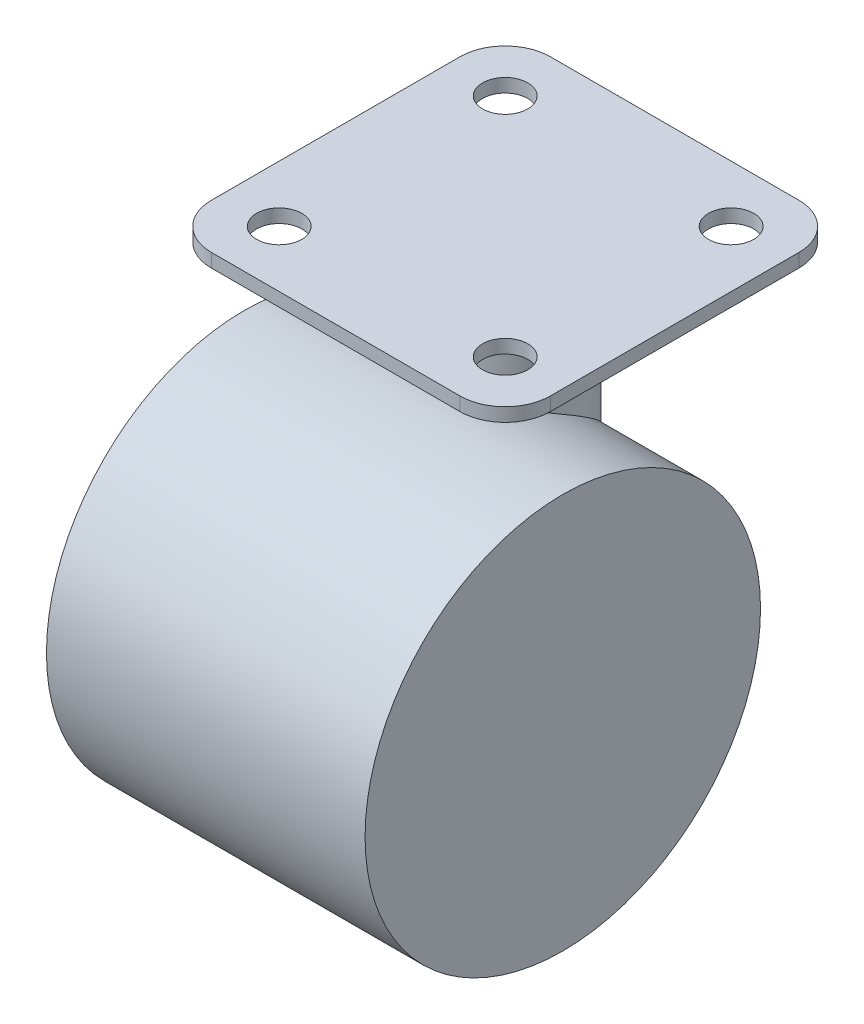
ISO-10303-21;
HEADER;
FILE_DESCRIPTION(('STEP AP214'),'2;1');
FILE_NAME('part.step','',(''),(''),'','','');
FILE_SCHEMA(('AUTOMOTIVE_DESIGN { 1 0 10303 214 1 1 1 1 }'));
ENDSEC;
DATA;
#1=APPLICATION_CONTEXT('core data for automotive mechanical design processes');
#2=APPLICATION_PROTOCOL_DEFINITION('international standard','automotive_design',2000,#1);
#3=PRODUCT_CONTEXT('',#1,'mechanical');
#4=PRODUCT('Part','Part','',(#3));
#5=PRODUCT_RELATED_PRODUCT_CATEGORY('part','',(#4));
#6=PRODUCT_DEFINITION_FORMATION('','',#4);
#7=PRODUCT_DEFINITION_CONTEXT('part definition',#1,'design');
#8=PRODUCT_DEFINITION('design','',#6,#7);
#9=PRODUCT_DEFINITION_SHAPE('','',#8);
#10=(LENGTH_UNIT() NAMED_UNIT(*) SI_UNIT(.MILLI.,.METRE.));
#11=(NAMED_UNIT(*) PLANE_ANGLE_UNIT() SI_UNIT($,.RADIAN.));
#12=(NAMED_UNIT(*) SI_UNIT($,.STERADIAN.) SOLID_ANGLE_UNIT());
#13=UNCERTAINTY_MEASURE_WITH_UNIT(LENGTH_MEASURE(1.E-05),#10,'distance_accuracy_value','');
#14=(GEOMETRIC_REPRESENTATION_CONTEXT(3) GLOBAL_UNCERTAINTY_ASSIGNED_CONTEXT((#13)) GLOBAL_UNIT_ASSIGNED_CONTEXT((#10,
#11,#12)) REPRESENTATION_CONTEXT('',''));
#15=CARTESIAN_POINT('',(0.,0.,0.));
#16=DIRECTION('',(0.,0.,1.));
#17=DIRECTION('',(1.,0.,0.));
#18=AXIS2_PLACEMENT_3D('',#15,#16,#17);
#19=CARTESIAN_POINT('',(14.1,-25.9,8.99999999999999));
#20=DIRECTION('',(-1.,0.,0.));
#21=DIRECTION('',(0.,0.,1.));
#22=AXIS2_PLACEMENT_3D('',#19,#20,#21);
#23=CYLINDRICAL_SURFACE('',#22,17.5);
#24=CARTESIAN_POINT('',(14.1,-25.9,8.99999999999999));
#25=DIRECTION('',(1.,0.,0.));
#26=DIRECTION('',(0.,0.,-1.));
#27=AXIS2_PLACEMENT_3D('',#24,#25,#26);
#28=CIRCLE('',#27,17.5);
#29=CARTESIAN_POINT('',(14.1,-25.9,-8.50000000000001));
#30=VERTEX_POINT('',#29);
#31=EDGE_CURVE('E11',#30,#30,#28,.T.);
#32=ORIENTED_EDGE('',*,*,#31,.F.);
#33=EDGE_LOOP('',(#32));
#34=FACE_BOUND('',#33,.T.);
#35=CARTESIAN_POINT('',(-14.1,-25.9,8.99999999999999));
#36=DIRECTION('',(1.,0.,0.));
#37=DIRECTION('',(0.,0.,-1.));
#38=AXIS2_PLACEMENT_3D('',#35,#36,#37);
#39=CIRCLE('',#38,17.5);
#40=CARTESIAN_POINT('',(-14.1,-25.9,-8.50000000000001));
#41=VERTEX_POINT('',#40);
#42=EDGE_CURVE('E45',#41,#41,#39,.T.);
#43=ORIENTED_EDGE('',*,*,#42,.T.);
#44=EDGE_LOOP('',(#43));
#45=FACE_BOUND('',#44,.T.);
#46=ADVANCED_FACE('F42',(#34,#45),#23,.T.);
#47=CARTESIAN_POINT('',(14.1,-25.9,8.99999999999999));
#48=DIRECTION('',(1.,0.,0.));
#49=DIRECTION('',(0.,0.,-1.));
#50=AXIS2_PLACEMENT_3D('',#47,#48,#49);
#51=PLANE('',#50);
#52=ORIENTED_EDGE('',*,*,#31,.T.);
#53=EDGE_LOOP('',(#52));
#54=FACE_BOUND('',#53,.T.);
#55=ADVANCED_FACE('F57',(#54),#51,.T.);
#56=CARTESIAN_POINT('',(-14.1,-25.9,8.99999999999999));
#57=DIRECTION('',(1.,0.,0.));
#58=DIRECTION('',(0.,0.,-1.));
#59=AXIS2_PLACEMENT_3D('',#56,#57,#58);
#60=PLANE('',#59);
#61=ORIENTED_EDGE('',*,*,#42,.F.);
#62=EDGE_LOOP('',(#61));
#63=FACE_BOUND('',#62,.T.);
#64=ADVANCED_FACE('F55',(#63),#60,.F.);
#65=CLOSED_SHELL('',(#46,#55,#64));
#66=MANIFOLD_SOLID_BREP('B2',#65);
#67=CARTESIAN_POINT('',(15.,-0.6,15.));
#68=DIRECTION('',(1.,0.,0.));
#69=DIRECTION('',(0.,0.,-1.));
#70=AXIS2_PLACEMENT_3D('',#67,#68,#69);
#71=PLANE('',#70);
#72=DIRECTION('',(0.,0.,-1.));
#73=VECTOR('',#72,1.);
#74=CARTESIAN_POINT('',(15.,-0.6,15.));
#75=LINE('',#74,#73);
#76=CARTESIAN_POINT('',(15.,-0.6,11.));
#77=VERTEX_POINT('',#76);
#78=CARTESIAN_POINT('',(15.,-0.6,-11.));
#79=VERTEX_POINT('',#78);
#80=EDGE_CURVE('E213',#77,#79,#75,.T.);
#81=ORIENTED_EDGE('',*,*,#80,.T.);
#82=DIRECTION('',(0.,1.,0.));
#83=VECTOR('',#82,1.);
#84=CARTESIAN_POINT('',(15.,-0.6,-11.));
#85=LINE('',#84,#83);
#86=CARTESIAN_POINT('',(15.,0.6,-11.));
#87=VERTEX_POINT('',#86);
#88=EDGE_CURVE('E167',#79,#87,#85,.T.);
#89=ORIENTED_EDGE('',*,*,#88,.T.);
#90=DIRECTION('',(0.,0.,-1.));
#91=VECTOR('',#90,1.);
#92=CARTESIAN_POINT('',(15.,0.6,15.));
#93=LINE('',#92,#91);
#94=CARTESIAN_POINT('',(15.,0.6,11.));
#95=VERTEX_POINT('',#94);
#96=EDGE_CURVE('E151',#95,#87,#93,.T.);
#97=ORIENTED_EDGE('',*,*,#96,.F.);
#98=DIRECTION('',(0.,1.,0.));
#99=VECTOR('',#98,1.);
#100=CARTESIAN_POINT('',(15.,-0.6,11.));
#101=LINE('',#100,#99);
#102=EDGE_CURVE('E164',#95,#77,#101,.F.);
#103=ORIENTED_EDGE('',*,*,#102,.T.);
#104=EDGE_LOOP('',(#81,#89,#97,#103));
#105=FACE_BOUND('',#104,.T.);
#106=ADVANCED_FACE('F82',(#105),#71,.T.);
#107=CARTESIAN_POINT('',(-15.,-0.6,15.));
#108=DIRECTION('',(0.,0.,1.));
#109=DIRECTION('',(1.,0.,0.));
#110=AXIS2_PLACEMENT_3D('',#107,#108,#109);
#111=PLANE('',#110);
#112=DIRECTION('',(1.,0.,0.));
#113=VECTOR('',#112,1.);
#114=CARTESIAN_POINT('',(-15.,-0.6,15.));
#115=LINE('',#114,#113);
#116=CARTESIAN_POINT('',(-11.,-0.6,15.));
#117=VERTEX_POINT('',#116);
#118=CARTESIAN_POINT('',(11.,-0.6,15.));
#119=VERTEX_POINT('',#118);
#120=EDGE_CURVE('E174',#117,#119,#115,.T.);
#121=ORIENTED_EDGE('',*,*,#120,.T.);
#122=DIRECTION('',(0.,1.,0.));
#123=VECTOR('',#122,1.);
#124=CARTESIAN_POINT('',(11.,-0.6,15.));
#125=LINE('',#124,#123);
#126=CARTESIAN_POINT('',(11.,0.6,15.));
#127=VERTEX_POINT('',#126);
#128=EDGE_CURVE('E200',#119,#127,#125,.T.);
#129=ORIENTED_EDGE('',*,*,#128,.T.);
#130=DIRECTION('',(1.,0.,0.));
#131=VECTOR('',#130,1.);
#132=CARTESIAN_POINT('',(-15.,0.6,15.));
#133=LINE('',#132,#131);
#134=CARTESIAN_POINT('',(-11.,0.6,15.));
#135=VERTEX_POINT('',#134);
#136=EDGE_CURVE('E153',#135,#127,#133,.T.);
#137=ORIENTED_EDGE('',*,*,#136,.F.);
#138=DIRECTION('',(0.,1.,0.));
#139=VECTOR('',#138,1.);
#140=CARTESIAN_POINT('',(-11.,-0.6,15.));
#141=LINE('',#140,#139);
#142=EDGE_CURVE('E198',#135,#117,#141,.F.);
#143=ORIENTED_EDGE('',*,*,#142,.T.);
#144=EDGE_LOOP('',(#121,#129,#137,#143));
#145=FACE_BOUND('',#144,.T.);
#146=ADVANCED_FACE('F202',(#145),#111,.T.);
#147=CARTESIAN_POINT('',(-15.,-0.6,15.));
#148=DIRECTION('',(-1.,0.,0.));
#149=DIRECTION('',(0.,0.,1.));
#150=AXIS2_PLACEMENT_3D('',#147,#148,#149);
#151=PLANE('',#150);
#152=DIRECTION('',(0.,0.,1.));
#153=VECTOR('',#152,1.);
#154=CARTESIAN_POINT('',(-15.,-0.6,15.));
#155=LINE('',#154,#153);
#156=CARTESIAN_POINT('',(-15.,-0.6,-11.));
#157=VERTEX_POINT('',#156);
#158=CARTESIAN_POINT('',(-15.,-0.6,11.));
#159=VERTEX_POINT('',#158);
#160=EDGE_CURVE('E179',#157,#159,#155,.T.);
#161=ORIENTED_EDGE('',*,*,#160,.T.);
#162=DIRECTION('',(0.,1.,0.));
#163=VECTOR('',#162,1.);
#164=CARTESIAN_POINT('',(-15.,-0.6,11.));
#165=LINE('',#164,#163);
#166=CARTESIAN_POINT('',(-15.,0.6,11.));
#167=VERTEX_POINT('',#166);
#168=EDGE_CURVE('E40',#159,#167,#165,.T.);
#169=ORIENTED_EDGE('',*,*,#168,.T.);
#170=DIRECTION('',(0.,0.,1.));
#171=VECTOR('',#170,1.);
#172=CARTESIAN_POINT('',(-15.,0.6,15.));
#173=LINE('',#172,#171);
#174=CARTESIAN_POINT('',(-15.,0.6,-11.));
#175=VERTEX_POINT('',#174);
#176=EDGE_CURVE('E211',#175,#167,#173,.T.);
#177=ORIENTED_EDGE('',*,*,#176,.F.);
#178=DIRECTION('',(0.,1.,0.));
#179=VECTOR('',#178,1.);
#180=CARTESIAN_POINT('',(-15.,-0.6,-11.));
#181=LINE('',#180,#179);
#182=EDGE_CURVE('E90',#175,#157,#181,.F.);
#183=ORIENTED_EDGE('',*,*,#182,.T.);
#184=EDGE_LOOP('',(#161,#169,#177,#183));
#185=FACE_BOUND('',#184,.T.);
#186=ADVANCED_FACE('F210',(#185),#151,.T.);
#187=CARTESIAN_POINT('',(-15.,-0.6,-15.));
#188=DIRECTION('',(0.,0.,-1.));
#189=DIRECTION('',(-1.,0.,0.));
#190=AXIS2_PLACEMENT_3D('',#187,#188,#189);
#191=PLANE('',#190);
#192=DIRECTION('',(-1.,0.,0.));
#193=VECTOR('',#192,1.);
#194=CARTESIAN_POINT('',(-15.,0.6,-15.));
#195=LINE('',#194,#193);
#196=CARTESIAN_POINT('',(11.,0.6,-15.));
#197=VERTEX_POINT('',#196);
#198=CARTESIAN_POINT('',(-11.,0.6,-15.));
#199=VERTEX_POINT('',#198);
#200=EDGE_CURVE('E168',#197,#199,#195,.T.);
#201=ORIENTED_EDGE('',*,*,#200,.F.);
#202=DIRECTION('',(0.,1.,0.));
#203=VECTOR('',#202,1.);
#204=CARTESIAN_POINT('',(11.,-0.6,-15.));
#205=LINE('',#204,#203);
#206=CARTESIAN_POINT('',(11.,-0.6,-15.));
#207=VERTEX_POINT('',#206);
#208=EDGE_CURVE('E190',#197,#207,#205,.F.);
#209=ORIENTED_EDGE('',*,*,#208,.T.);
#210=DIRECTION('',(-1.,0.,0.));
#211=VECTOR('',#210,1.);
#212=CARTESIAN_POINT('',(-15.,-0.6,-15.));
#213=LINE('',#212,#211);
#214=CARTESIAN_POINT('',(-11.,-0.6,-15.));
#215=VERTEX_POINT('',#214);
#216=EDGE_CURVE('E217',#207,#215,#213,.T.);
#217=ORIENTED_EDGE('',*,*,#216,.T.);
#218=DIRECTION('',(0.,1.,0.));
#219=VECTOR('',#218,1.);
#220=CARTESIAN_POINT('',(-11.,-0.6,-15.));
#221=LINE('',#220,#219);
#222=EDGE_CURVE('E187',#215,#199,#221,.T.);
#223=ORIENTED_EDGE('',*,*,#222,.T.);
#224=EDGE_LOOP('',(#201,#209,#217,#223));
#225=FACE_BOUND('',#224,.T.);
#226=ADVANCED_FACE('F271',(#225),#191,.T.);
#227=CARTESIAN_POINT('',(0.,-0.6,0.));
#228=DIRECTION('',(0.,-1.,0.));
#229=DIRECTION('',(0.,0.,-1.));
#230=AXIS2_PLACEMENT_3D('',#227,#228,#229);
#231=PLANE('',#230);
#232=CARTESIAN_POINT('',(0.,-0.6,0.));
#233=DIRECTION('',(0.,-1.,0.));
#234=DIRECTION('',(0.,0.,-1.));
#235=AXIS2_PLACEMENT_3D('',#232,#233,#234);
#236=CIRCLE('',#235,6.);
#237=CARTESIAN_POINT('',(0.,-0.6,-6.));
#238=VERTEX_POINT('',#237);
#239=EDGE_CURVE('E251',#238,#238,#236,.T.);
#240=ORIENTED_EDGE('',*,*,#239,.F.);
#241=EDGE_LOOP('',(#240));
#242=FACE_BOUND('',#241,.T.);
#243=CARTESIAN_POINT('',(10.,-0.6,-10.));
#244=DIRECTION('',(0.,1.,0.));
#245=DIRECTION('',(0.,0.,1.));
#246=AXIS2_PLACEMENT_3D('',#243,#244,#245);
#247=CIRCLE('',#246,2.00000000000001);
#248=CARTESIAN_POINT('',(10.,-0.6,-7.99999999999999));
#249=VERTEX_POINT('',#248);
#250=EDGE_CURVE('E224',#249,#249,#247,.T.);
#251=ORIENTED_EDGE('',*,*,#250,.T.);
#252=EDGE_LOOP('',(#251));
#253=FACE_BOUND('',#252,.T.);
#254=CARTESIAN_POINT('',(10.,-0.6,10.));
#255=DIRECTION('',(0.,1.,0.));
#256=DIRECTION('',(0.,0.,1.));
#257=AXIS2_PLACEMENT_3D('',#254,#255,#256);
#258=CIRCLE('',#257,2.00000000000001);
#259=CARTESIAN_POINT('',(10.,-0.6,12.));
#260=VERTEX_POINT('',#259);
#261=EDGE_CURVE('E237',#260,#260,#258,.T.);
#262=ORIENTED_EDGE('',*,*,#261,.T.);
#263=EDGE_LOOP('',(#262));
#264=FACE_BOUND('',#263,.T.);
#265=CARTESIAN_POINT('',(-10.,-0.6,10.));
#266=DIRECTION('',(0.,1.,0.));
#267=DIRECTION('',(0.,0.,1.));
#268=AXIS2_PLACEMENT_3D('',#265,#266,#267);
#269=CIRCLE('',#268,2.);
#270=CARTESIAN_POINT('',(-10.,-0.6,12.));
#271=VERTEX_POINT('',#270);
#272=EDGE_CURVE('E230',#271,#271,#269,.T.);
#273=ORIENTED_EDGE('',*,*,#272,.T.);
#274=EDGE_LOOP('',(#273));
#275=FACE_BOUND('',#274,.T.);
#276=CARTESIAN_POINT('',(-10.,-0.6,-10.));
#277=DIRECTION('',(0.,1.,0.));
#278=DIRECTION('',(0.,0.,1.));
#279=AXIS2_PLACEMENT_3D('',#276,#277,#278);
#280=CIRCLE('',#279,2.);
#281=CARTESIAN_POINT('',(-10.,-0.6,-8.));
#282=VERTEX_POINT('',#281);
#283=EDGE_CURVE('E169',#282,#282,#280,.T.);
#284=ORIENTED_EDGE('',*,*,#283,.T.);
#285=EDGE_LOOP('',(#284));
#286=FACE_BOUND('',#285,.T.);
#287=ORIENTED_EDGE('',*,*,#216,.F.);
#288=CARTESIAN_POINT('',(11.,-0.6,-11.));
#289=DIRECTION('',(0.,-1.,0.));
#290=DIRECTION('',(0.,0.,-1.));
#291=AXIS2_PLACEMENT_3D('',#288,#289,#290);
#292=CIRCLE('',#291,4.);
#293=EDGE_CURVE('E196',#207,#79,#292,.T.);
#294=ORIENTED_EDGE('',*,*,#293,.T.);
#295=ORIENTED_EDGE('',*,*,#80,.F.);
#296=CARTESIAN_POINT('',(11.,-0.6,11.));
#297=DIRECTION('',(0.,-1.,0.));
#298=DIRECTION('',(0.,0.,-1.));
#299=AXIS2_PLACEMENT_3D('',#296,#297,#298);
#300=CIRCLE('',#299,4.);
#301=EDGE_CURVE('E173',#77,#119,#300,.T.);
#302=ORIENTED_EDGE('',*,*,#301,.T.);
#303=ORIENTED_EDGE('',*,*,#120,.F.);
#304=CARTESIAN_POINT('',(-11.,-0.6,11.));
#305=DIRECTION('',(0.,-1.,0.));
#306=DIRECTION('',(0.,0.,-1.));
#307=AXIS2_PLACEMENT_3D('',#304,#305,#306);
#308=CIRCLE('',#307,4.);
#309=EDGE_CURVE('E97',#117,#159,#308,.T.);
#310=ORIENTED_EDGE('',*,*,#309,.T.);
#311=ORIENTED_EDGE('',*,*,#160,.F.);
#312=CARTESIAN_POINT('',(-11.,-0.6,-11.));
#313=DIRECTION('',(0.,-1.,0.));
#314=DIRECTION('',(0.,0.,-1.));
#315=AXIS2_PLACEMENT_3D('',#312,#313,#314);
#316=CIRCLE('',#315,4.);
#317=EDGE_CURVE('E192',#157,#215,#316,.T.);
#318=ORIENTED_EDGE('',*,*,#317,.T.);
#319=EDGE_LOOP('',(#287,#294,#295,#302,#303,#310,#311,#318));
#320=FACE_BOUND('',#319,.T.);
#321=ADVANCED_FACE('F205',(#242,#253,#264,#275,#286,#320),#231,.T.);
#322=CARTESIAN_POINT('',(0.,0.6,0.));
#323=DIRECTION('',(0.,-1.,0.));
#324=DIRECTION('',(0.,0.,-1.));
#325=AXIS2_PLACEMENT_3D('',#322,#323,#324);
#326=PLANE('',#325);
#327=CARTESIAN_POINT('',(10.,0.6,-10.));
#328=DIRECTION('',(0.,1.,0.));
#329=DIRECTION('',(0.,0.,1.));
#330=AXIS2_PLACEMENT_3D('',#327,#328,#329);
#331=CIRCLE('',#330,2.00000000000001);
#332=CARTESIAN_POINT('',(10.,0.6,-7.99999999999999));
#333=VERTEX_POINT('',#332);
#334=EDGE_CURVE('E240',#333,#333,#331,.T.);
#335=ORIENTED_EDGE('',*,*,#334,.F.);
#336=EDGE_LOOP('',(#335));
#337=FACE_BOUND('',#336,.T.);
#338=CARTESIAN_POINT('',(10.,0.6,10.));
#339=DIRECTION('',(0.,1.,0.));
#340=DIRECTION('',(0.,0.,1.));
#341=AXIS2_PLACEMENT_3D('',#338,#339,#340);
#342=CIRCLE('',#341,2.00000000000001);
#343=CARTESIAN_POINT('',(10.,0.6,12.));
#344=VERTEX_POINT('',#343);
#345=EDGE_CURVE('E234',#344,#344,#342,.T.);
#346=ORIENTED_EDGE('',*,*,#345,.F.);
#347=EDGE_LOOP('',(#346));
#348=FACE_BOUND('',#347,.T.);
#349=CARTESIAN_POINT('',(-10.,0.6,10.));
#350=DIRECTION('',(0.,1.,0.));
#351=DIRECTION('',(0.,0.,1.));
#352=AXIS2_PLACEMENT_3D('',#349,#350,#351);
#353=CIRCLE('',#352,2.);
#354=CARTESIAN_POINT('',(-10.,0.6,12.));
#355=VERTEX_POINT('',#354);
#356=EDGE_CURVE('E227',#355,#355,#353,.T.);
#357=ORIENTED_EDGE('',*,*,#356,.F.);
#358=EDGE_LOOP('',(#357));
#359=FACE_BOUND('',#358,.T.);
#360=CARTESIAN_POINT('',(-10.,0.6,-10.));
#361=DIRECTION('',(0.,1.,0.));
#362=DIRECTION('',(0.,0.,1.));
#363=AXIS2_PLACEMENT_3D('',#360,#361,#362);
#364=CIRCLE('',#363,2.);
#365=CARTESIAN_POINT('',(-10.,0.6,-8.));
#366=VERTEX_POINT('',#365);
#367=EDGE_CURVE('E221',#366,#366,#364,.T.);
#368=ORIENTED_EDGE('',*,*,#367,.F.);
#369=EDGE_LOOP('',(#368));
#370=FACE_BOUND('',#369,.T.);
#371=ORIENTED_EDGE('',*,*,#96,.T.);
#372=CARTESIAN_POINT('',(11.,0.6,-11.));
#373=DIRECTION('',(0.,-1.,0.));
#374=DIRECTION('',(0.,0.,-1.));
#375=AXIS2_PLACEMENT_3D('',#372,#373,#374);
#376=CIRCLE('',#375,4.);
#377=EDGE_CURVE('E158',#87,#197,#376,.F.);
#378=ORIENTED_EDGE('',*,*,#377,.T.);
#379=ORIENTED_EDGE('',*,*,#200,.T.);
#380=CARTESIAN_POINT('',(-11.,0.6,-11.));
#381=DIRECTION('',(0.,-1.,0.));
#382=DIRECTION('',(0.,0.,-1.));
#383=AXIS2_PLACEMENT_3D('',#380,#381,#382);
#384=CIRCLE('',#383,4.);
#385=EDGE_CURVE('E176',#199,#175,#384,.F.);
#386=ORIENTED_EDGE('',*,*,#385,.T.);
#387=ORIENTED_EDGE('',*,*,#176,.T.);
#388=CARTESIAN_POINT('',(-11.,0.6,11.));
#389=DIRECTION('',(0.,-1.,0.));
#390=DIRECTION('',(0.,0.,-1.));
#391=AXIS2_PLACEMENT_3D('',#388,#389,#390);
#392=CIRCLE('',#391,4.);
#393=EDGE_CURVE('E159',#167,#135,#392,.F.);
#394=ORIENTED_EDGE('',*,*,#393,.T.);
#395=ORIENTED_EDGE('',*,*,#136,.T.);
#396=CARTESIAN_POINT('',(11.,0.6,11.));
#397=DIRECTION('',(0.,-1.,0.));
#398=DIRECTION('',(0.,0.,-1.));
#399=AXIS2_PLACEMENT_3D('',#396,#397,#398);
#400=CIRCLE('',#399,4.);
#401=EDGE_CURVE('E148',#127,#95,#400,.F.);
#402=ORIENTED_EDGE('',*,*,#401,.T.);
#403=EDGE_LOOP('',(#371,#378,#379,#386,#387,#394,#395,#402));
#404=FACE_BOUND('',#403,.T.);
#405=ADVANCED_FACE('F150',(#337,#348,#359,#370,#404),#326,.F.);
#406=CARTESIAN_POINT('',(-10.,-0.6,-10.));
#407=DIRECTION('',(0.,1.,0.));
#408=DIRECTION('',(0.,0.,1.));
#409=AXIS2_PLACEMENT_3D('',#406,#407,#408);
#410=CYLINDRICAL_SURFACE('',#409,2.);
#411=ORIENTED_EDGE('',*,*,#283,.F.);
#412=EDGE_LOOP('',(#411));
#413=FACE_BOUND('',#412,.T.);
#414=ORIENTED_EDGE('',*,*,#367,.T.);
#415=EDGE_LOOP('',(#414));
#416=FACE_BOUND('',#415,.T.);
#417=ADVANCED_FACE('F303',(#413,#416),#410,.F.);
#418=CARTESIAN_POINT('',(-10.,-0.6,10.));
#419=DIRECTION('',(0.,1.,0.));
#420=DIRECTION('',(0.,0.,1.));
#421=AXIS2_PLACEMENT_3D('',#418,#419,#420);
#422=CYLINDRICAL_SURFACE('',#421,2.);
#423=ORIENTED_EDGE('',*,*,#272,.F.);
#424=EDGE_LOOP('',(#423));
#425=FACE_BOUND('',#424,.T.);
#426=ORIENTED_EDGE('',*,*,#356,.T.);
#427=EDGE_LOOP('',(#426));
#428=FACE_BOUND('',#427,.T.);
#429=ADVANCED_FACE('F308',(#425,#428),#422,.F.);
#430=CARTESIAN_POINT('',(10.,-0.6,10.));
#431=DIRECTION('',(0.,1.,0.));
#432=DIRECTION('',(0.,0.,1.));
#433=AXIS2_PLACEMENT_3D('',#430,#431,#432);
#434=CYLINDRICAL_SURFACE('',#433,2.00000000000001);
#435=ORIENTED_EDGE('',*,*,#261,.F.);
#436=EDGE_LOOP('',(#435));
#437=FACE_BOUND('',#436,.T.);
#438=ORIENTED_EDGE('',*,*,#345,.T.);
#439=EDGE_LOOP('',(#438));
#440=FACE_BOUND('',#439,.T.);
#441=ADVANCED_FACE('F312',(#437,#440),#434,.F.);
#442=CARTESIAN_POINT('',(10.,-0.6,-10.));
#443=DIRECTION('',(0.,1.,0.));
#444=DIRECTION('',(0.,0.,1.));
#445=AXIS2_PLACEMENT_3D('',#442,#443,#444);
#446=CYLINDRICAL_SURFACE('',#445,2.00000000000001);
#447=ORIENTED_EDGE('',*,*,#250,.F.);
#448=EDGE_LOOP('',(#447));
#449=FACE_BOUND('',#448,.T.);
#450=ORIENTED_EDGE('',*,*,#334,.T.);
#451=EDGE_LOOP('',(#450));
#452=FACE_BOUND('',#451,.T.);
#453=ADVANCED_FACE('F276',(#449,#452),#446,.F.);
#454=CARTESIAN_POINT('',(11.,-0.6,-11.));
#455=DIRECTION('',(0.,1.,0.));
#456=DIRECTION('',(0.,0.,1.));
#457=AXIS2_PLACEMENT_3D('',#454,#455,#456);
#458=CYLINDRICAL_SURFACE('',#457,4.);
#459=ORIENTED_EDGE('',*,*,#293,.F.);
#460=ORIENTED_EDGE('',*,*,#208,.F.);
#461=ORIENTED_EDGE('',*,*,#377,.F.);
#462=ORIENTED_EDGE('',*,*,#88,.F.);
#463=EDGE_LOOP('',(#459,#460,#461,#462));
#464=FACE_BOUND('',#463,.T.);
#465=ADVANCED_FACE('F273',(#464),#458,.T.);
#466=CARTESIAN_POINT('',(11.,-0.6,11.));
#467=DIRECTION('',(0.,1.,0.));
#468=DIRECTION('',(0.,0.,1.));
#469=AXIS2_PLACEMENT_3D('',#466,#467,#468);
#470=CYLINDRICAL_SURFACE('',#469,4.);
#471=ORIENTED_EDGE('',*,*,#301,.F.);
#472=ORIENTED_EDGE('',*,*,#102,.F.);
#473=ORIENTED_EDGE('',*,*,#401,.F.);
#474=ORIENTED_EDGE('',*,*,#128,.F.);
#475=EDGE_LOOP('',(#471,#472,#473,#474));
#476=FACE_BOUND('',#475,.T.);
#477=ADVANCED_FACE('F172',(#476),#470,.T.);
#478=CARTESIAN_POINT('',(-11.,-0.6,11.));
#479=DIRECTION('',(0.,1.,0.));
#480=DIRECTION('',(0.,0.,1.));
#481=AXIS2_PLACEMENT_3D('',#478,#479,#480);
#482=CYLINDRICAL_SURFACE('',#481,4.);
#483=ORIENTED_EDGE('',*,*,#309,.F.);
#484=ORIENTED_EDGE('',*,*,#142,.F.);
#485=ORIENTED_EDGE('',*,*,#393,.F.);
#486=ORIENTED_EDGE('',*,*,#168,.F.);
#487=EDGE_LOOP('',(#483,#484,#485,#486));
#488=FACE_BOUND('',#487,.T.);
#489=ADVANCED_FACE('F208',(#488),#482,.T.);
#490=CARTESIAN_POINT('',(-11.,-0.6,-11.));
#491=DIRECTION('',(0.,1.,0.));
#492=DIRECTION('',(0.,0.,1.));
#493=AXIS2_PLACEMENT_3D('',#490,#491,#492);
#494=CYLINDRICAL_SURFACE('',#493,4.);
#495=ORIENTED_EDGE('',*,*,#317,.F.);
#496=ORIENTED_EDGE('',*,*,#182,.F.);
#497=ORIENTED_EDGE('',*,*,#385,.F.);
#498=ORIENTED_EDGE('',*,*,#222,.F.);
#499=EDGE_LOOP('',(#495,#496,#497,#498));
#500=FACE_BOUND('',#499,.T.);
#501=ADVANCED_FACE('F84',(#500),#494,.T.);
#502=CARTESIAN_POINT('',(0.,-43.401,0.));
#503=DIRECTION('',(0.,1.,0.));
#504=DIRECTION('',(0.,0.,1.));
#505=AXIS2_PLACEMENT_3D('',#502,#503,#504);
#506=CYLINDRICAL_SURFACE('',#505,6.);
#507=ORIENTED_EDGE('',*,*,#239,.T.);
#508=EDGE_LOOP('',(#507));
#509=FACE_BOUND('',#508,.T.);
#510=CARTESIAN_POINT('',(0.,-8.65906035043332,6.));
#511=CARTESIAN_POINT('',(-0.165550131336847,-8.65906152566624,6.00000272383897));
#512=CARTESIAN_POINT('',(-0.331063350792486,-8.66024913906501,5.9931463990695));
#513=CARTESIAN_POINT('',(-0.660971772576927,-8.66504415702075,5.96577772936452));
#514=CARTESIAN_POINT('',(-0.825366766900127,-8.66865199997723,5.94526291033941));
#515=CARTESIAN_POINT('',(-1.15191396682122,-8.67841161820516,5.89071448550199));
#516=CARTESIAN_POINT('',(-1.3140648341121,-8.68456484914352,5.85667314452679));
#517=CARTESIAN_POINT('',(-1.63493916669699,-8.69961684881858,5.77532476663341));
#518=CARTESIAN_POINT('',(-1.79366136232179,-8.70851661658778,5.72801290323214));
#519=CARTESIAN_POINT('',(-2.10641558102023,-8.72932246264401,5.62052884627702));
#520=CARTESIAN_POINT('',(-2.26044947516237,-8.74122732351219,5.56036186208299));
#521=CARTESIAN_POINT('',(-2.56285479346125,-8.76837175154052,5.42761956933155));
#522=CARTESIAN_POINT('',(-2.71122362516827,-8.78361282444005,5.35503866121712));
#523=CARTESIAN_POINT('',(-3.00111636081653,-8.81778246512559,5.19812067078887));
#524=CARTESIAN_POINT('',(-3.14264198476074,-8.83671010023714,5.11378656348427));
#525=CARTESIAN_POINT('',(-3.41780550483394,-8.87862632428406,4.93412509729673));
#526=CARTESIAN_POINT('',(-3.55144703925272,-8.90161302020603,4.83880287007793));
#527=CARTESIAN_POINT('',(-3.80921694340567,-8.95188709696103,4.63857158868817));
#528=CARTESIAN_POINT('',(-3.93339585840265,-8.97914883817727,4.53372116303023));
#529=CARTESIAN_POINT('',(-4.17220277682237,-9.03840779487226,4.31496635368302));
#530=CARTESIAN_POINT('',(-4.28683422053429,-9.07040329297306,4.20106526042903));
#531=CARTESIAN_POINT('',(-4.50586953355639,-9.13944591969436,3.96522892316075));
#532=CARTESIAN_POINT('',(-4.61027269437795,-9.17649339782885,3.84329312357873));
#533=CARTESIAN_POINT('',(-4.80823850085369,-9.25588120633936,3.5925421936756));
#534=CARTESIAN_POINT('',(-4.90180115689918,-9.29822153164176,3.46372706994894));
#535=CARTESIAN_POINT('',(-5.07737695483321,-9.3882284411996,3.2008062533313));
#536=CARTESIAN_POINT('',(-5.15942259886251,-9.43587932675666,3.06671687426342));
#537=CARTESIAN_POINT('',(-5.31201654118163,-9.53669625791185,2.79408190579823));
#538=CARTESIAN_POINT('',(-5.38256090016694,-9.58986418298993,2.65553480896125));
#539=CARTESIAN_POINT('',(-5.5119677424943,-9.70166588601694,2.37529471538089));
#540=CARTESIAN_POINT('',(-5.57083386909727,-9.76029795090074,2.23360271514008));
#541=CARTESIAN_POINT('',(-5.67695872818618,-9.88295482548536,1.94816266514437));
#542=CARTESIAN_POINT('',(-5.72421305799608,-9.94698166832777,1.80441385733268));
#543=CARTESIAN_POINT('',(-5.80905573146923,-10.0831178645457,1.50976066723073));
#544=CARTESIAN_POINT('',(-5.84613625919004,-10.1554572729734,1.35881622448368));
#545=CARTESIAN_POINT('',(-5.90815932316817,-10.3055002110392,1.05707602973262));
#546=CARTESIAN_POINT('',(-5.93309741599456,-10.383205692491,0.906280352283244));
#547=CARTESIAN_POINT('',(-5.99031821615814,-10.6238664495086,0.455685749934423));
#548=CARTESIAN_POINT('',(-6.00504135474413,-10.7944219525566,0.157557638630977));
#549=CARTESIAN_POINT('',(-5.9911088463481,-11.1746441070162,-0.46376625766591));
#550=CARTESIAN_POINT('',(-5.95679656865313,-11.3865344035128,-0.785432798033382));
#551=CARTESIAN_POINT('',(-5.84097128435526,-11.8265591236889,-1.40834788610983));
#552=CARTESIAN_POINT('',(-5.7594550353644,-12.0546946622918,-1.70959502964532));
#553=CARTESIAN_POINT('',(-5.59623613918111,-12.4279762370465,-2.17157640481848));
#554=CARTESIAN_POINT('',(-5.52780507936888,-12.5695808159463,-2.34007800686525));
#555=CARTESIAN_POINT('',(-5.37713842903486,-12.8557705546773,-2.66813595449683));
#556=CARTESIAN_POINT('',(-5.29490451297115,-13.0003553511071,-2.82769338199299));
#557=CARTESIAN_POINT('',(-5.11712081439647,-13.2919083422225,-3.13801939885173));
#558=CARTESIAN_POINT('',(-5.02152879501715,-13.438882736426,-3.28875787066373));
#559=CARTESIAN_POINT('',(-4.81777933617858,-13.7335866575508,-3.58059548347361));
#560=CARTESIAN_POINT('',(-4.70962490168867,-13.8813159958374,-3.72169691691011));
#561=CARTESIAN_POINT('',(-4.45876943203091,-14.2049672528761,-4.02050858870218));
#562=CARTESIAN_POINT('',(-4.31343791022973,-14.3807944591348,-4.17612503256811));
#563=CARTESIAN_POINT('',(-4.00491251805378,-14.7293118438331,-4.47286601832236));
#564=CARTESIAN_POINT('',(-3.84170678525947,-14.9019998491917,-4.61398081415635));
#565=CARTESIAN_POINT('',(-3.49734131108384,-15.2399024631632,-4.88014229677071));
#566=CARTESIAN_POINT('',(-3.31626207485593,-15.4051461025724,-5.00525568603757));
#567=CARTESIAN_POINT('',(-2.93407587124913,-15.7237696207908,-5.23843874767685));
#568=CARTESIAN_POINT('',(-2.73300032728032,-15.8771674613174,-5.34653449304108));
#569=CARTESIAN_POINT('',(-2.34901242826904,-16.1370872129777,-5.52430473617078));
#570=CARTESIAN_POINT('',(-2.1699706042905,-16.2469654673056,-5.59737404209891));
#571=CARTESIAN_POINT('',(-1.79602827457456,-16.4479319586691,-5.72829825452773));
#572=CARTESIAN_POINT('',(-1.60113298267136,-16.5390263387194,-5.78615813677341));
#573=CARTESIAN_POINT('',(-1.29607725940438,-16.655895002561,-5.85929706670522));
#574=CARTESIAN_POINT('',(-1.19139922054472,-16.6917572826137,-5.88152078631855));
#575=CARTESIAN_POINT('',(-0.978638689845668,-16.7552763787099,-5.92063729973414));
#576=CARTESIAN_POINT('',(-0.870558378215281,-16.7829383357858,-5.93753343398668));
#577=CARTESIAN_POINT('',(-0.651896489648272,-16.8289123200047,-5.96549690422604));
#578=CARTESIAN_POINT('',(-0.541320373658555,-16.8472430185166,-5.9765758814543));
#579=CARTESIAN_POINT('',(-0.31851666547978,-16.8737712122901,-5.99257948855838));
#580=CARTESIAN_POINT('',(-0.206289441188591,-16.8819709313309,-5.99750546903741));
#581=CARTESIAN_POINT('',(0.00287968018752165,-16.8874206167034,-6.00078049864032));
#582=CARTESIAN_POINT('',(0.0997760614499746,-16.8860351702327,-5.99994916597771));
#583=CARTESIAN_POINT('',(0.293024494859093,-16.8755116604383,-5.99362026612554));
#584=CARTESIAN_POINT('',(0.389376361104912,-16.8663710935032,-5.98812119203316));
#585=CARTESIAN_POINT('',(0.580773390526551,-16.8406664411924,-5.97259824567768));
#586=CARTESIAN_POINT('',(0.675817586035358,-16.8240971342182,-5.96257119069925));
#587=CARTESIAN_POINT('',(0.863927963458193,-16.7840970167161,-5.93823481777521));
#588=CARTESIAN_POINT('',(0.956993001046494,-16.7606623465168,-5.92392309090985));
#589=CARTESIAN_POINT('',(1.163249836863,-16.7011052182988,-5.88730445381221));
#590=CARTESIAN_POINT('',(1.2757551898008,-16.6632794809295,-5.86389660577495));
#591=CARTESIAN_POINT('',(1.49639485168781,-16.5795095703976,-5.81151277352678));
#592=CARTESIAN_POINT('',(1.60452565519079,-16.5335590389809,-5.78253242685688));
#593=CARTESIAN_POINT('',(1.92226083838915,-16.3855335796695,-5.68804025174093));
#594=CARTESIAN_POINT('',(2.12498042459265,-16.2733557615765,-5.61501980583113));
#595=CARTESIAN_POINT('',(2.47857040682504,-16.0524719668706,-5.46688541520955));
#596=CARTESIAN_POINT('',(2.63233997627057,-15.946529564663,-5.39432436378612));
#597=CARTESIAN_POINT('',(2.92857644068693,-15.7261377734077,-5.23940539580717));
#598=CARTESIAN_POINT('',(3.07103594763198,-15.6116829168099,-5.15704116192176));
#599=CARTESIAN_POINT('',(3.34563449812673,-15.376741112653,-4.98329120638858));
#600=CARTESIAN_POINT('',(3.47775051118924,-15.2562416325036,-4.89188632427198));
#601=CARTESIAN_POINT('',(3.73197233748925,-15.0113897653158,-4.70081384041153));
#602=CARTESIAN_POINT('',(3.85407930906123,-14.8870378264197,-4.60114719748412));
#603=CARTESIAN_POINT('',(4.1358129637839,-14.5855841047235,-4.35237606047543));
#604=CARTESIAN_POINT('',(4.29085818255959,-14.4073192873142,-4.19946941876535));
#605=CARTESIAN_POINT('',(4.58275116284022,-14.0491192568622,-3.87883839891192));
#606=CARTESIAN_POINT('',(4.7195917814705,-13.8691834176166,-3.71110824722849));
#607=CARTESIAN_POINT('',(4.97467565911851,-13.5102008407571,-3.36145697502947));
#608=CARTESIAN_POINT('',(5.09293143570722,-13.3311535840461,-3.17954553074803));
#609=CARTESIAN_POINT('',(5.31004373621381,-12.9759337028991,-2.80193485354883));
#610=CARTESIAN_POINT('',(5.40890627454113,-12.7997602028168,-2.60623992096253));
#611=CARTESIAN_POINT('',(5.57040216779023,-12.4824749474677,-2.23692746608689));
#612=CARTESIAN_POINT('',(5.63634672303378,-12.3406033631169,-2.06540575086408));
#613=CARTESIAN_POINT('',(5.75298962207588,-12.0611737900229,-1.71388222745329));
#614=CARTESIAN_POINT('',(5.80369063115738,-11.923615050965,-1.53388190809434));
#615=CARTESIAN_POINT('',(5.88856551761835,-11.6540318792899,-1.16633034397123));
#616=CARTESIAN_POINT('',(5.92275932087905,-11.5220009508377,-0.978788500476874));
#617=CARTESIAN_POINT('',(5.9733304353176,-11.2643942942998,-0.596980683452176));
#618=CARTESIAN_POINT('',(5.98971107417489,-11.1388173647193,-0.402715972820394));
#619=CARTESIAN_POINT('',(6.00201849181476,-10.9170088941299,-0.0441220777637859));
#620=CARTESIAN_POINT('',(6.00108123987811,-10.8195476900808,0.119342269351987));
#621=CARTESIAN_POINT('',(5.98545905147655,-10.6302897493368,0.448858266609195));
#622=CARTESIAN_POINT('',(5.97077693893567,-10.538491853227,0.614909378400911));
#623=CARTESIAN_POINT('',(5.92695658287824,-10.3611002179848,0.948400266312808));
#624=CARTESIAN_POINT('',(5.89782043921965,-10.2755055797228,1.11583983724658));
#625=CARTESIAN_POINT('',(5.82449853648145,-10.1109786116348,1.45072164309331));
#626=CARTESIAN_POINT('',(5.78031255295781,-10.0320463811897,1.61816387800877));
#627=CARTESIAN_POINT('',(5.67615029831909,-9.88075350522675,1.9524747296863));
#628=CARTESIAN_POINT('',(5.61607738243712,-9.8084368574609,2.11933327628637));
#629=CARTESIAN_POINT('',(5.48008104216776,-9.67118581792201,2.44961279653378));
#630=CARTESIAN_POINT('',(5.40415736125722,-9.60625154564898,2.61303371450065));
#631=CARTESIAN_POINT('',(5.23657868190054,-9.48388450880731,2.93446450218454));
#632=CARTESIAN_POINT('',(5.14492900845496,-9.42644921655312,3.09247618187765));
#633=CARTESIAN_POINT('',(4.94627095604695,-9.31898602173139,3.40118867541253));
#634=CARTESIAN_POINT('',(4.83926423982277,-9.26895731842721,3.55189027837073));
#635=CARTESIAN_POINT('',(4.62291170912784,-9.18107256147295,3.82832809876581));
#636=CARTESIAN_POINT('',(4.51506019577542,-9.14248574620176,3.95500470848436));
#637=CARTESIAN_POINT('',(4.28834585856233,-9.07074355060015,4.1997510722223));
#638=CARTESIAN_POINT('',(4.16948346360311,-9.03758795884913,4.31782116116738));
#639=CARTESIAN_POINT('',(3.92156590861125,-8.97636716613472,4.54417184584898));
#640=CARTESIAN_POINT('',(3.79251073190952,-8.94830197349632,4.65245242557528));
#641=CARTESIAN_POINT('',(3.52515057561547,-8.89686959456587,4.85816443078028));
#642=CARTESIAN_POINT('',(3.38684574310805,-8.87350233359257,4.95559602871019));
#643=CARTESIAN_POINT('',(3.10749818672031,-8.8318644402329,5.13516899946911));
#644=CARTESIAN_POINT('',(2.96676398383603,-8.81343269046903,5.21775352483653));
#645=CARTESIAN_POINT('',(2.67870481354024,-8.78015984662625,5.37132962989487));
#646=CARTESIAN_POINT('',(2.53137998531321,-8.76531867676186,5.4423214542598));
#647=CARTESIAN_POINT('',(2.23128845212588,-8.73888885204098,5.57207772939221));
#648=CARTESIAN_POINT('',(2.07852594007308,-8.72729774981772,5.63085137202667));
#649=CARTESIAN_POINT('',(1.76858024862841,-8.70704921459644,5.7357564759063));
#650=CARTESIAN_POINT('',(1.61139779368211,-8.69839130383757,5.78188999575164));
#651=CARTESIAN_POINT('',(1.21547342792253,-8.6801434905169,5.88066757142946));
#652=CARTESIAN_POINT('',(0.974626266027603,-8.6721880950874,5.9253614934291));
#653=CARTESIAN_POINT('',(0.489159285998728,-8.66164558991085,5.98502606776549));
#654=CARTESIAN_POINT('',(0.244539373640466,-8.65905861445934,5.99999597653067));
#655=CARTESIAN_POINT('',(0.,-8.65906035043332,6.));
#656=B_SPLINE_CURVE_WITH_KNOTS('',3,(#510,#511,#512,#513,#514,#515,#516,#517,#518,#519,#520,
#521,#522,#523,#524,#525,#526,#527,#528,#529,#530,#531,#532,#533,#534,#535,#536,#537,#538,#539,
#540,#541,#542,#543,#544,#545,#546,#547,#548,#549,#550,#551,#552,#553,#554,#555,#556,#557,#558,
#559,#560,#561,#562,#563,#564,#565,#566,#567,#568,#569,#570,#571,#572,#573,#574,#575,#576,#577,
#578,#579,#580,#581,#582,#583,#584,#585,#586,#587,#588,#589,#590,#591,#592,#593,#594,#595,#596,
#597,#598,#599,#600,#601,#602,#603,#604,#605,#606,#607,#608,#609,#610,#611,#612,#613,#614,#615,
#616,#617,#618,#619,#620,#621,#622,#623,#624,#625,#626,#627,#628,#629,#630,#631,#632,#633,#634,
#635,#636,#637,#638,#639,#640,#641,#642,#643,#644,#645,#646,#647,#648,#649,#650,#651,#652,#653,
#654,#655),.UNSPECIFIED.,.T.,.F.,(4,2,2,2,2,2,2,2,2,2,2,2,2,2,2,2,2,2,2,2,2,2,2,2,2,2,2,2,2,2,2,
2,2,2,2,2,2,2,2,2,2,2,2,2,2,2,2,2,2,2,2,2,2,2,2,2,2,2,2,2,2,2,2,2,2,2,2,2,2,2,2,2,4),(0.,
0.496440544321715,0.992971037992951,1.48978588298731,1.98678165413725,2.48357640532837,
2.9805958399194,3.47748969501444,3.97415242413969,4.46794295163263,4.9615547722527,
5.45520076003994,5.94884627463164,6.44106939135114,6.93346074680347,7.42569824840966,
7.91812209756837,8.43189230745858,8.94585038657753,9.9733565846609,11.1293934893086,
12.2855098102585,12.9764576415258,13.6673217127317,14.3604218444767,15.0533565245936,
15.880818758328,16.7088335130237,17.5332756046255,18.3564419980104,19.0223237873708,
19.6879874624096,20.0261768875864,20.3641538409332,20.7014518349616,21.0386757779422,
21.3289867586189,21.6193914970369,21.9100006792881,22.2007735550699,22.5631411462065,
22.9257935821963,23.6518160715201,24.2520963849351,24.8527656447267,25.4547363938425,
26.0566373789516,26.8998203865723,27.7433332612704,28.5862755415361,29.4289559860476,
30.1247829512398,30.8204881825716,31.5153515137432,32.2100850150987,32.7804812008554,
33.3507602226682,33.9209564195312,34.4911611203212,35.0649176823581,35.6386835305876,
36.2122554771744,36.7857653687459,37.2974816329131,37.8091779728236,38.3208751495705,
38.8325641914155,39.3246255561352,39.8166765341308,40.3083559865584,40.7999553152492,
41.5332451168699,42.2665532621299),.UNSPECIFIED.);
#657=CARTESIAN_POINT('',(0.,-8.65906035043332,6.));
#658=VERTEX_POINT('',#657);
#659=EDGE_CURVE('E231',#658,#658,#656,.T.);
#660=ORIENTED_EDGE('',*,*,#659,.F.);
#661=EDGE_LOOP('',(#660));
#662=FACE_BOUND('',#661,.T.);
#663=ADVANCED_FACE('F252',(#509,#662),#506,.T.);
#664=CARTESIAN_POINT('',(14.1,-25.9,8.99999999999999));
#665=DIRECTION('',(-1.,0.,0.));
#666=DIRECTION('',(0.,0.,1.));
#667=AXIS2_PLACEMENT_3D('',#664,#665,#666);
#668=CYLINDRICAL_SURFACE('',#667,17.5);
#669=ORIENTED_EDGE('',*,*,#659,.T.);
#670=EDGE_LOOP('',(#669));
#671=FACE_BOUND('',#670,.T.);
#672=ADVANCED_FACE('F255',(#671),#668,.F.);
#673=CLOSED_SHELL('',(#106,#146,#186,#226,#321,#405,#417,#429,#441,#453,#465,#477,#489,#501,
#663,#672));
#674=MANIFOLD_SOLID_BREP('B6',#673);
#675=ADVANCED_BREP_SHAPE_REPRESENTATION('',(#18,#66,#674),#14);
#676=SHAPE_DEFINITION_REPRESENTATION(#9,#675);
ENDSEC;
END-ISO-10303-21;
